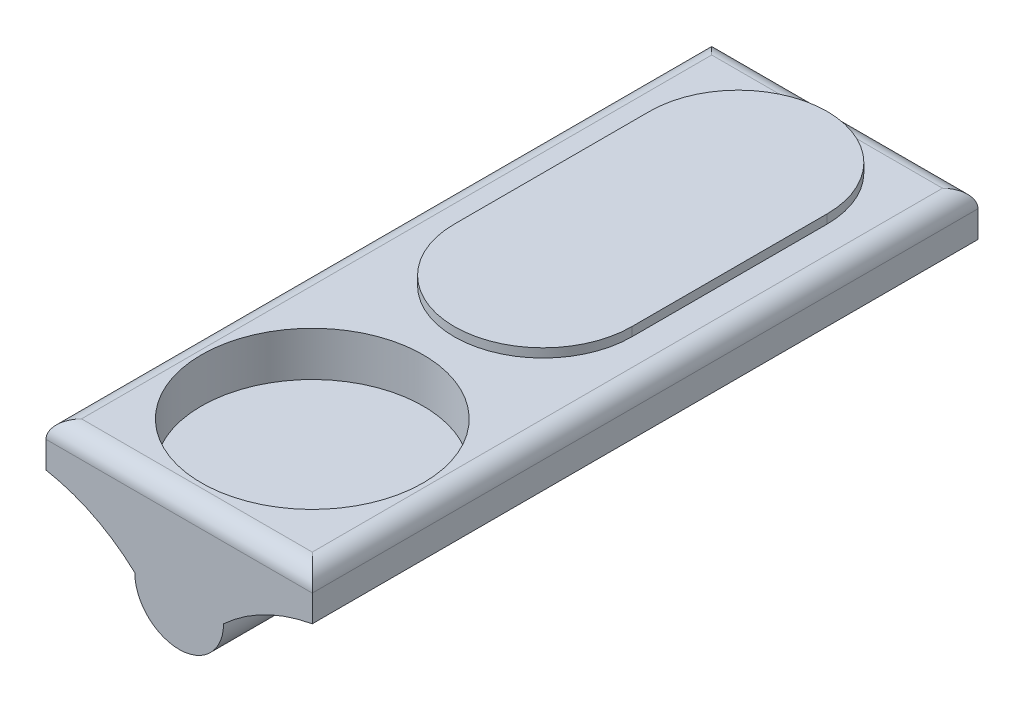
ISO-10303-21;
HEADER;
FILE_DESCRIPTION(('STEP AP214'),'2;1');
FILE_NAME('part.step','',(''),(''),'','','');
FILE_SCHEMA(('AUTOMOTIVE_DESIGN { 1 0 10303 214 1 1 1 1 }'));
ENDSEC;
DATA;
#1=APPLICATION_CONTEXT('core data for automotive mechanical design processes');
#2=APPLICATION_PROTOCOL_DEFINITION('international standard','automotive_design',2000,#1);
#3=PRODUCT_CONTEXT('',#1,'mechanical');
#4=PRODUCT('Part','Part','',(#3));
#5=PRODUCT_RELATED_PRODUCT_CATEGORY('part','',(#4));
#6=PRODUCT_DEFINITION_FORMATION('','',#4);
#7=PRODUCT_DEFINITION_CONTEXT('part definition',#1,'design');
#8=PRODUCT_DEFINITION('design','',#6,#7);
#9=PRODUCT_DEFINITION_SHAPE('','',#8);
#10=(LENGTH_UNIT() NAMED_UNIT(*) SI_UNIT(.MILLI.,.METRE.));
#11=(NAMED_UNIT(*) PLANE_ANGLE_UNIT() SI_UNIT($,.RADIAN.));
#12=(NAMED_UNIT(*) SI_UNIT($,.STERADIAN.) SOLID_ANGLE_UNIT());
#13=UNCERTAINTY_MEASURE_WITH_UNIT(LENGTH_MEASURE(1.E-05),#10,'distance_accuracy_value','');
#14=(GEOMETRIC_REPRESENTATION_CONTEXT(3) GLOBAL_UNCERTAINTY_ASSIGNED_CONTEXT((#13)) GLOBAL_UNIT_ASSIGNED_CONTEXT((#10,
#11,#12)) REPRESENTATION_CONTEXT('',''));
#15=CARTESIAN_POINT('',(0.,0.,0.));
#16=DIRECTION('',(0.,0.,1.));
#17=DIRECTION('',(1.,0.,0.));
#18=AXIS2_PLACEMENT_3D('',#15,#16,#17);
#19=CARTESIAN_POINT('',(18.5877820186588,-14.6755640373177,-75.));
#20=DIRECTION('',(0.,0.,1.));
#21=DIRECTION('',(1.,0.,0.));
#22=AXIS2_PLACEMENT_3D('',#19,#20,#21);
#23=CYLINDRICAL_SURFACE('',#22,20.);
#24=CARTESIAN_POINT('',(18.5877820186588,-14.6755640373177,0.));
#25=DIRECTION('',(0.,0.,-1.));
#26=DIRECTION('',(-1.,0.,0.));
#27=AXIS2_PLACEMENT_3D('',#24,#25,#26);
#28=CIRCLE('',#27,20.);
#29=CARTESIAN_POINT('',(5.,0.,0.));
#30=VERTEX_POINT('',#29);
#31=CARTESIAN_POINT('',(15.,5.00000000000001,0.));
#32=VERTEX_POINT('',#31);
#33=EDGE_CURVE('E179',#30,#32,#28,.T.);
#34=ORIENTED_EDGE('',*,*,#33,.F.);
#35=DIRECTION('',(0.,0.,1.));
#36=VECTOR('',#35,1.);
#37=CARTESIAN_POINT('',(5.,0.,-75.));
#38=LINE('',#37,#36);
#39=CARTESIAN_POINT('',(5.,0.,-75.));
#40=VERTEX_POINT('',#39);
#41=EDGE_CURVE('E218',#40,#30,#38,.T.);
#42=ORIENTED_EDGE('',*,*,#41,.F.);
#43=CARTESIAN_POINT('',(18.5877820186588,-14.6755640373177,-75.));
#44=DIRECTION('',(0.,0.,-1.));
#45=DIRECTION('',(-1.,0.,0.));
#46=AXIS2_PLACEMENT_3D('',#43,#44,#45);
#47=CIRCLE('',#46,20.);
#48=CARTESIAN_POINT('',(15.,5.00000000000001,-75.));
#49=VERTEX_POINT('',#48);
#50=EDGE_CURVE('E181',#40,#49,#47,.T.);
#51=ORIENTED_EDGE('',*,*,#50,.T.);
#52=DIRECTION('',(0.,0.,1.));
#53=VECTOR('',#52,1.);
#54=CARTESIAN_POINT('',(15.,5.00000000000001,-75.));
#55=LINE('',#54,#53);
#56=EDGE_CURVE('E200',#49,#32,#55,.T.);
#57=ORIENTED_EDGE('',*,*,#56,.T.);
#58=EDGE_LOOP('',(#34,#42,#51,#57));
#59=FACE_BOUND('',#58,.T.);
#60=ADVANCED_FACE('F42',(#59),#23,.F.);
#61=CARTESIAN_POINT('',(0.,0.,-75.));
#62=DIRECTION('',(0.,0.,1.));
#63=DIRECTION('',(1.,0.,0.));
#64=AXIS2_PLACEMENT_3D('',#61,#62,#63);
#65=CYLINDRICAL_SURFACE('',#64,5.);
#66=CARTESIAN_POINT('',(0.,0.,0.));
#67=DIRECTION('',(0.,0.,1.));
#68=DIRECTION('',(1.,0.,0.));
#69=AXIS2_PLACEMENT_3D('',#66,#67,#68);
#70=CIRCLE('',#69,5.);
#71=CARTESIAN_POINT('',(-5.,0.,0.));
#72=VERTEX_POINT('',#71);
#73=EDGE_CURVE('E186',#72,#30,#70,.T.);
#74=ORIENTED_EDGE('',*,*,#73,.F.);
#75=DIRECTION('',(0.,0.,1.));
#76=VECTOR('',#75,1.);
#77=CARTESIAN_POINT('',(-5.,0.,-75.));
#78=LINE('',#77,#76);
#79=CARTESIAN_POINT('',(-5.,0.,-75.));
#80=VERTEX_POINT('',#79);
#81=EDGE_CURVE('E222',#80,#72,#78,.T.);
#82=ORIENTED_EDGE('',*,*,#81,.F.);
#83=CARTESIAN_POINT('',(0.,0.,-75.));
#84=DIRECTION('',(0.,0.,1.));
#85=DIRECTION('',(1.,0.,0.));
#86=AXIS2_PLACEMENT_3D('',#83,#84,#85);
#87=CIRCLE('',#86,5.);
#88=EDGE_CURVE('E196',#80,#40,#87,.T.);
#89=ORIENTED_EDGE('',*,*,#88,.T.);
#90=ORIENTED_EDGE('',*,*,#41,.T.);
#91=EDGE_LOOP('',(#74,#82,#89,#90));
#92=FACE_BOUND('',#91,.T.);
#93=ADVANCED_FACE('F333',(#92),#65,.T.);
#94=CARTESIAN_POINT('',(-18.5877820186588,-14.6755640373177,-75.));
#95=DIRECTION('',(0.,0.,1.));
#96=DIRECTION('',(1.,0.,0.));
#97=AXIS2_PLACEMENT_3D('',#94,#95,#96);
#98=CYLINDRICAL_SURFACE('',#97,20.);
#99=CARTESIAN_POINT('',(-18.5877820186588,-14.6755640373177,0.));
#100=DIRECTION('',(0.,0.,-1.));
#101=DIRECTION('',(-1.,0.,0.));
#102=AXIS2_PLACEMENT_3D('',#99,#100,#101);
#103=CIRCLE('',#102,20.);
#104=CARTESIAN_POINT('',(-15.,5.,0.));
#105=VERTEX_POINT('',#104);
#106=EDGE_CURVE('E211',#105,#72,#103,.T.);
#107=ORIENTED_EDGE('',*,*,#106,.F.);
#108=DIRECTION('',(0.,0.,1.));
#109=VECTOR('',#108,1.);
#110=CARTESIAN_POINT('',(-15.,5.,-75.));
#111=LINE('',#110,#109);
#112=CARTESIAN_POINT('',(-15.,5.,-75.));
#113=VERTEX_POINT('',#112);
#114=EDGE_CURVE('E225',#113,#105,#111,.T.);
#115=ORIENTED_EDGE('',*,*,#114,.F.);
#116=CARTESIAN_POINT('',(-18.5877820186588,-14.6755640373177,-75.));
#117=DIRECTION('',(0.,0.,-1.));
#118=DIRECTION('',(-1.,0.,0.));
#119=AXIS2_PLACEMENT_3D('',#116,#117,#118);
#120=CIRCLE('',#119,20.);
#121=EDGE_CURVE('E192',#113,#80,#120,.T.);
#122=ORIENTED_EDGE('',*,*,#121,.T.);
#123=ORIENTED_EDGE('',*,*,#81,.T.);
#124=EDGE_LOOP('',(#107,#115,#122,#123));
#125=FACE_BOUND('',#124,.T.);
#126=ADVANCED_FACE('F330',(#125),#98,.F.);
#127=CARTESIAN_POINT('',(-15.,10.,-75.));
#128=DIRECTION('',(-1.,0.,0.));
#129=DIRECTION('',(0.,-1.,0.));
#130=AXIS2_PLACEMENT_3D('',#127,#128,#129);
#131=PLANE('',#130);
#132=DIRECTION('',(0.,-1.,0.));
#133=VECTOR('',#132,1.);
#134=CARTESIAN_POINT('',(-15.,10.,0.));
#135=LINE('',#134,#133);
#136=CARTESIAN_POINT('',(-15.,8.,0.));
#137=VERTEX_POINT('',#136);
#138=EDGE_CURVE('E208',#137,#105,#135,.T.);
#139=ORIENTED_EDGE('',*,*,#138,.F.);
#140=DIRECTION('',(0.,0.,1.));
#141=VECTOR('',#140,1.);
#142=CARTESIAN_POINT('',(-15.,8.,-75.));
#143=LINE('',#142,#141);
#144=CARTESIAN_POINT('',(-15.,8.,-75.));
#145=VERTEX_POINT('',#144);
#146=EDGE_CURVE('E11',#137,#145,#143,.F.);
#147=ORIENTED_EDGE('',*,*,#146,.T.);
#148=DIRECTION('',(0.,-1.,0.));
#149=VECTOR('',#148,1.);
#150=CARTESIAN_POINT('',(-15.,10.,-75.));
#151=LINE('',#150,#149);
#152=EDGE_CURVE('E189',#145,#113,#151,.T.);
#153=ORIENTED_EDGE('',*,*,#152,.T.);
#154=ORIENTED_EDGE('',*,*,#114,.T.);
#155=EDGE_LOOP('',(#139,#147,#153,#154));
#156=FACE_BOUND('',#155,.T.);
#157=ADVANCED_FACE('F325',(#156),#131,.T.);
#158=CARTESIAN_POINT('',(-15.,10.,-75.));
#159=DIRECTION('',(0.,1.,0.));
#160=DIRECTION('',(-1.,0.,0.));
#161=AXIS2_PLACEMENT_3D('',#158,#159,#160);
#162=PLANE('',#161);
#163=CARTESIAN_POINT('',(0.,10.,-15.));
#164=DIRECTION('',(0.,1.,0.));
#165=DIRECTION('',(-1.,0.,0.));
#166=AXIS2_PLACEMENT_3D('',#163,#164,#165);
#167=CIRCLE('',#166,12.5);
#168=CARTESIAN_POINT('',(-12.5,10.,-15.));
#169=VERTEX_POINT('',#168);
#170=EDGE_CURVE('E268',#169,#169,#167,.T.);
#171=ORIENTED_EDGE('',*,*,#170,.F.);
#172=EDGE_LOOP('',(#171));
#173=FACE_BOUND('',#172,.T.);
#174=DIRECTION('',(0.,0.,1.));
#175=VECTOR('',#174,1.);
#176=CARTESIAN_POINT('',(-13.,10.,-75.));
#177=LINE('',#176,#175);
#178=CARTESIAN_POINT('',(-13.,10.,-73.));
#179=VERTEX_POINT('',#178);
#180=CARTESIAN_POINT('',(-13.,10.,-2.));
#181=VERTEX_POINT('',#180);
#182=EDGE_CURVE('E234',#179,#181,#177,.T.);
#183=ORIENTED_EDGE('',*,*,#182,.T.);
#184=DIRECTION('',(-1.,0.,0.));
#185=VECTOR('',#184,1.);
#186=CARTESIAN_POINT('',(15.,10.,-2.));
#187=LINE('',#186,#185);
#188=CARTESIAN_POINT('',(13.,10.,-2.));
#189=VERTEX_POINT('',#188);
#190=EDGE_CURVE('E246',#181,#189,#187,.F.);
#191=ORIENTED_EDGE('',*,*,#190,.T.);
#192=DIRECTION('',(0.,0.,1.));
#193=VECTOR('',#192,1.);
#194=CARTESIAN_POINT('',(13.,10.,-75.));
#195=LINE('',#194,#193);
#196=CARTESIAN_POINT('',(13.,10.,-73.));
#197=VERTEX_POINT('',#196);
#198=EDGE_CURVE('E243',#189,#197,#195,.F.);
#199=ORIENTED_EDGE('',*,*,#198,.T.);
#200=DIRECTION('',(-1.,0.,0.));
#201=VECTOR('',#200,1.);
#202=CARTESIAN_POINT('',(-15.,10.,-73.));
#203=LINE('',#202,#201);
#204=CARTESIAN_POINT('',(0.,10.,-73.));
#205=VERTEX_POINT('',#204);
#206=EDGE_CURVE('E240',#197,#205,#203,.T.);
#207=ORIENTED_EDGE('',*,*,#206,.T.);
#208=CARTESIAN_POINT('',(0.,10.,-63.));
#209=DIRECTION('',(0.,1.,0.));
#210=DIRECTION('',(-1.,0.,0.));
#211=AXIS2_PLACEMENT_3D('',#208,#209,#210);
#212=CIRCLE('',#211,10.);
#213=CARTESIAN_POINT('',(10.,10.,-63.));
#214=VERTEX_POINT('',#213);
#215=EDGE_CURVE('E288',#214,#205,#212,.T.);
#216=ORIENTED_EDGE('',*,*,#215,.F.);
#217=DIRECTION('',(0.,0.,-1.));
#218=VECTOR('',#217,1.);
#219=CARTESIAN_POINT('',(10.,10.,-63.));
#220=LINE('',#219,#218);
#221=CARTESIAN_POINT('',(10.,10.,-41.));
#222=VERTEX_POINT('',#221);
#223=EDGE_CURVE('E158',#222,#214,#220,.T.);
#224=ORIENTED_EDGE('',*,*,#223,.F.);
#225=CARTESIAN_POINT('',(0.,10.,-41.));
#226=DIRECTION('',(0.,1.,0.));
#227=DIRECTION('',(-1.,0.,0.));
#228=AXIS2_PLACEMENT_3D('',#225,#226,#227);
#229=CIRCLE('',#228,10.);
#230=CARTESIAN_POINT('',(-10.,10.,-41.));
#231=VERTEX_POINT('',#230);
#232=EDGE_CURVE('E294',#231,#222,#229,.T.);
#233=ORIENTED_EDGE('',*,*,#232,.F.);
#234=DIRECTION('',(0.,0.,1.));
#235=VECTOR('',#234,1.);
#236=CARTESIAN_POINT('',(-10.,10.,-63.));
#237=LINE('',#236,#235);
#238=CARTESIAN_POINT('',(-10.,10.,-63.));
#239=VERTEX_POINT('',#238);
#240=EDGE_CURVE('E291',#239,#231,#237,.T.);
#241=ORIENTED_EDGE('',*,*,#240,.F.);
#242=EDGE_CURVE('E163',#205,#239,#212,.T.);
#243=ORIENTED_EDGE('',*,*,#242,.F.);
#244=DIRECTION('',(-1.,0.,0.));
#245=VECTOR('',#244,1.);
#246=CARTESIAN_POINT('',(-15.,10.,-73.));
#247=LINE('',#246,#245);
#248=EDGE_CURVE('E237',#205,#179,#247,.T.);
#249=ORIENTED_EDGE('',*,*,#248,.T.);
#250=EDGE_LOOP('',(#183,#191,#199,#207,#216,#224,#233,#241,#243,#249));
#251=FACE_BOUND('',#250,.T.);
#252=ADVANCED_FACE('F310',(#173,#251),#162,.T.);
#253=CARTESIAN_POINT('',(15.,10.,-75.));
#254=DIRECTION('',(1.,0.,0.));
#255=DIRECTION('',(0.,0.,-1.));
#256=AXIS2_PLACEMENT_3D('',#253,#254,#255);
#257=PLANE('',#256);
#258=DIRECTION('',(0.,1.,0.));
#259=VECTOR('',#258,1.);
#260=CARTESIAN_POINT('',(15.,10.,-75.));
#261=LINE('',#260,#259);
#262=CARTESIAN_POINT('',(15.,8.00000000000001,-75.));
#263=VERTEX_POINT('',#262);
#264=EDGE_CURVE('E185',#49,#263,#261,.T.);
#265=ORIENTED_EDGE('',*,*,#264,.T.);
#266=DIRECTION('',(0.,0.,1.));
#267=VECTOR('',#266,1.);
#268=CARTESIAN_POINT('',(15.,8.00000000000001,-75.));
#269=LINE('',#268,#267);
#270=CARTESIAN_POINT('',(15.,8.00000000000001,0.));
#271=VERTEX_POINT('',#270);
#272=EDGE_CURVE('E250',#263,#271,#269,.T.);
#273=ORIENTED_EDGE('',*,*,#272,.T.);
#274=DIRECTION('',(0.,1.,0.));
#275=VECTOR('',#274,1.);
#276=CARTESIAN_POINT('',(15.,10.,0.));
#277=LINE('',#276,#275);
#278=EDGE_CURVE('E204',#32,#271,#277,.T.);
#279=ORIENTED_EDGE('',*,*,#278,.F.);
#280=ORIENTED_EDGE('',*,*,#56,.F.);
#281=EDGE_LOOP('',(#265,#273,#279,#280));
#282=FACE_BOUND('',#281,.T.);
#283=ADVANCED_FACE('F339',(#282),#257,.T.);
#284=CARTESIAN_POINT('',(18.5877820186588,-14.6755640373177,-75.));
#285=DIRECTION('',(0.,0.,-1.));
#286=DIRECTION('',(-1.,0.,0.));
#287=AXIS2_PLACEMENT_3D('',#284,#285,#286);
#288=PLANE('',#287);
#289=CARTESIAN_POINT('',(0.,0.,-75.));
#290=DIRECTION('',(0.,0.,-1.));
#291=DIRECTION('',(-1.,0.,0.));
#292=AXIS2_PLACEMENT_3D('',#289,#290,#291);
#293=CIRCLE('',#292,4.);
#294=CARTESIAN_POINT('',(-4.,0.,-75.));
#295=VERTEX_POINT('',#294);
#296=EDGE_CURVE('E166',#295,#295,#293,.T.);
#297=ORIENTED_EDGE('',*,*,#296,.F.);
#298=EDGE_LOOP('',(#297));
#299=FACE_BOUND('',#298,.T.);
#300=ORIENTED_EDGE('',*,*,#152,.F.);
#301=DIRECTION('',(-1.,0.,0.));
#302=VECTOR('',#301,1.);
#303=CARTESIAN_POINT('',(18.5877820186588,8.,-75.));
#304=LINE('',#303,#302);
#305=EDGE_CURVE('E52',#145,#263,#304,.F.);
#306=ORIENTED_EDGE('',*,*,#305,.T.);
#307=ORIENTED_EDGE('',*,*,#264,.F.);
#308=ORIENTED_EDGE('',*,*,#50,.F.);
#309=ORIENTED_EDGE('',*,*,#88,.F.);
#310=ORIENTED_EDGE('',*,*,#121,.F.);
#311=EDGE_LOOP('',(#300,#306,#307,#308,#309,#310));
#312=FACE_BOUND('',#311,.T.);
#313=ADVANCED_FACE('F403',(#299,#312),#288,.T.);
#314=CARTESIAN_POINT('',(18.5877820186588,-14.6755640373177,0.));
#315=DIRECTION('',(0.,0.,-1.));
#316=DIRECTION('',(-1.,0.,0.));
#317=AXIS2_PLACEMENT_3D('',#314,#315,#316);
#318=PLANE('',#317);
#319=ORIENTED_EDGE('',*,*,#278,.T.);
#320=DIRECTION('',(-1.,0.,0.));
#321=VECTOR('',#320,1.);
#322=CARTESIAN_POINT('',(-15.,8.,0.));
#323=LINE('',#322,#321);
#324=EDGE_CURVE('E221',#271,#137,#323,.T.);
#325=ORIENTED_EDGE('',*,*,#324,.T.);
#326=ORIENTED_EDGE('',*,*,#138,.T.);
#327=ORIENTED_EDGE('',*,*,#106,.T.);
#328=ORIENTED_EDGE('',*,*,#73,.T.);
#329=ORIENTED_EDGE('',*,*,#33,.T.);
#330=EDGE_LOOP('',(#319,#325,#326,#327,#328,#329));
#331=FACE_BOUND('',#330,.T.);
#332=ADVANCED_FACE('F323',(#331),#318,.F.);
#333=CARTESIAN_POINT('',(0.,0.,-9.99999999999999));
#334=DIRECTION('',(0.,0.,-1.));
#335=DIRECTION('',(-1.,0.,0.));
#336=AXIS2_PLACEMENT_3D('',#333,#334,#335);
#337=CYLINDRICAL_SURFACE('',#336,4.);
#338=CARTESIAN_POINT('',(0.,0.,-9.99999999999999));
#339=DIRECTION('',(0.,0.,-1.));
#340=DIRECTION('',(-1.,0.,0.));
#341=AXIS2_PLACEMENT_3D('',#338,#339,#340);
#342=CIRCLE('',#341,4.);
#343=CARTESIAN_POINT('',(-4.,0.,-9.99999999999999));
#344=VERTEX_POINT('',#343);
#345=EDGE_CURVE('E171',#344,#344,#342,.T.);
#346=ORIENTED_EDGE('',*,*,#345,.F.);
#347=EDGE_LOOP('',(#346));
#348=FACE_BOUND('',#347,.T.);
#349=ORIENTED_EDGE('',*,*,#296,.T.);
#350=EDGE_LOOP('',(#349));
#351=FACE_BOUND('',#350,.T.);
#352=ADVANCED_FACE('F402',(#348,#351),#337,.F.);
#353=CARTESIAN_POINT('',(0.,0.,-9.99999999999999));
#354=DIRECTION('',(0.,0.,-1.));
#355=DIRECTION('',(-1.,0.,0.));
#356=AXIS2_PLACEMENT_3D('',#353,#354,#355);
#357=PLANE('',#356);
#358=ORIENTED_EDGE('',*,*,#345,.T.);
#359=EDGE_LOOP('',(#358));
#360=FACE_BOUND('',#359,.T.);
#361=ADVANCED_FACE('F388',(#360),#357,.T.);
#362=CARTESIAN_POINT('',(0.,11.,-63.));
#363=DIRECTION('',(0.,-1.,0.));
#364=DIRECTION('',(1.,0.,0.));
#365=AXIS2_PLACEMENT_3D('',#362,#363,#364);
#366=CYLINDRICAL_SURFACE('',#365,10.);
#367=ORIENTED_EDGE('',*,*,#215,.T.);
#368=ORIENTED_EDGE('',*,*,#242,.T.);
#369=DIRECTION('',(0.,-1.,0.));
#370=VECTOR('',#369,1.);
#371=CARTESIAN_POINT('',(-10.,11.,-63.));
#372=LINE('',#371,#370);
#373=CARTESIAN_POINT('',(-10.,11.,-63.));
#374=VERTEX_POINT('',#373);
#375=EDGE_CURVE('E141',#374,#239,#372,.T.);
#376=ORIENTED_EDGE('',*,*,#375,.F.);
#377=CARTESIAN_POINT('',(0.,11.,-63.));
#378=DIRECTION('',(0.,1.,0.));
#379=DIRECTION('',(-1.,0.,0.));
#380=AXIS2_PLACEMENT_3D('',#377,#378,#379);
#381=CIRCLE('',#380,10.);
#382=CARTESIAN_POINT('',(10.,11.,-63.));
#383=VERTEX_POINT('',#382);
#384=EDGE_CURVE('E148',#383,#374,#381,.T.);
#385=ORIENTED_EDGE('',*,*,#384,.F.);
#386=DIRECTION('',(0.,-1.,0.));
#387=VECTOR('',#386,1.);
#388=CARTESIAN_POINT('',(10.,11.,-63.));
#389=LINE('',#388,#387);
#390=EDGE_CURVE('E287',#383,#214,#389,.T.);
#391=ORIENTED_EDGE('',*,*,#390,.T.);
#392=EDGE_LOOP('',(#367,#368,#376,#385,#391));
#393=FACE_BOUND('',#392,.T.);
#394=ADVANCED_FACE('F161',(#393),#366,.T.);
#395=CARTESIAN_POINT('',(-10.,11.,-63.));
#396=DIRECTION('',(1.,0.,0.));
#397=DIRECTION('',(0.,1.,0.));
#398=AXIS2_PLACEMENT_3D('',#395,#396,#397);
#399=PLANE('',#398);
#400=ORIENTED_EDGE('',*,*,#240,.T.);
#401=DIRECTION('',(0.,-1.,0.));
#402=VECTOR('',#401,1.);
#403=CARTESIAN_POINT('',(-10.,11.,-41.));
#404=LINE('',#403,#402);
#405=CARTESIAN_POINT('',(-10.,11.,-41.));
#406=VERTEX_POINT('',#405);
#407=EDGE_CURVE('E143',#406,#231,#404,.T.);
#408=ORIENTED_EDGE('',*,*,#407,.F.);
#409=DIRECTION('',(0.,0.,1.));
#410=VECTOR('',#409,1.);
#411=CARTESIAN_POINT('',(-10.,11.,-63.));
#412=LINE('',#411,#410);
#413=EDGE_CURVE('E136',#374,#406,#412,.T.);
#414=ORIENTED_EDGE('',*,*,#413,.F.);
#415=ORIENTED_EDGE('',*,*,#375,.T.);
#416=EDGE_LOOP('',(#400,#408,#414,#415));
#417=FACE_BOUND('',#416,.T.);
#418=ADVANCED_FACE('F139',(#417),#399,.F.);
#419=CARTESIAN_POINT('',(0.,11.,-41.));
#420=DIRECTION('',(0.,-1.,0.));
#421=DIRECTION('',(1.,0.,0.));
#422=AXIS2_PLACEMENT_3D('',#419,#420,#421);
#423=CYLINDRICAL_SURFACE('',#422,10.);
#424=ORIENTED_EDGE('',*,*,#232,.T.);
#425=DIRECTION('',(0.,-1.,0.));
#426=VECTOR('',#425,1.);
#427=CARTESIAN_POINT('',(10.,11.,-41.));
#428=LINE('',#427,#426);
#429=CARTESIAN_POINT('',(10.,11.,-41.));
#430=VERTEX_POINT('',#429);
#431=EDGE_CURVE('E173',#430,#222,#428,.T.);
#432=ORIENTED_EDGE('',*,*,#431,.F.);
#433=CARTESIAN_POINT('',(0.,11.,-41.));
#434=DIRECTION('',(0.,1.,0.));
#435=DIRECTION('',(-1.,0.,0.));
#436=AXIS2_PLACEMENT_3D('',#433,#434,#435);
#437=CIRCLE('',#436,10.);
#438=EDGE_CURVE('E147',#406,#430,#437,.T.);
#439=ORIENTED_EDGE('',*,*,#438,.F.);
#440=ORIENTED_EDGE('',*,*,#407,.T.);
#441=EDGE_LOOP('',(#424,#432,#439,#440));
#442=FACE_BOUND('',#441,.T.);
#443=ADVANCED_FACE('F308',(#442),#423,.T.);
#444=CARTESIAN_POINT('',(10.,11.,-63.));
#445=DIRECTION('',(-1.,0.,0.));
#446=DIRECTION('',(0.,0.,1.));
#447=AXIS2_PLACEMENT_3D('',#444,#445,#446);
#448=PLANE('',#447);
#449=ORIENTED_EDGE('',*,*,#223,.T.);
#450=ORIENTED_EDGE('',*,*,#390,.F.);
#451=DIRECTION('',(0.,0.,-1.));
#452=VECTOR('',#451,1.);
#453=CARTESIAN_POINT('',(10.,11.,-63.));
#454=LINE('',#453,#452);
#455=EDGE_CURVE('E153',#430,#383,#454,.T.);
#456=ORIENTED_EDGE('',*,*,#455,.F.);
#457=ORIENTED_EDGE('',*,*,#431,.T.);
#458=EDGE_LOOP('',(#449,#450,#456,#457));
#459=FACE_BOUND('',#458,.T.);
#460=ADVANCED_FACE('F306',(#459),#448,.F.);
#461=CARTESIAN_POINT('',(0.,11.,-63.));
#462=DIRECTION('',(0.,1.,0.));
#463=DIRECTION('',(-1.,0.,0.));
#464=AXIS2_PLACEMENT_3D('',#461,#462,#463);
#465=PLANE('',#464);
#466=ORIENTED_EDGE('',*,*,#384,.T.);
#467=ORIENTED_EDGE('',*,*,#413,.T.);
#468=ORIENTED_EDGE('',*,*,#438,.T.);
#469=ORIENTED_EDGE('',*,*,#455,.T.);
#470=EDGE_LOOP('',(#466,#467,#468,#469));
#471=FACE_BOUND('',#470,.T.);
#472=ADVANCED_FACE('F151',(#471),#465,.T.);
#473=CARTESIAN_POINT('',(0.,5.,-15.));
#474=DIRECTION('',(0.,1.,0.));
#475=DIRECTION('',(-1.,0.,0.));
#476=AXIS2_PLACEMENT_3D('',#473,#474,#475);
#477=CYLINDRICAL_SURFACE('',#476,12.5);
#478=CARTESIAN_POINT('',(0.,5.,-15.));
#479=DIRECTION('',(0.,1.,0.));
#480=DIRECTION('',(-1.,0.,0.));
#481=AXIS2_PLACEMENT_3D('',#478,#479,#480);
#482=CIRCLE('',#481,12.5);
#483=CARTESIAN_POINT('',(-12.5,5.,-15.));
#484=VERTEX_POINT('',#483);
#485=EDGE_CURVE('E275',#484,#484,#482,.T.);
#486=ORIENTED_EDGE('',*,*,#485,.F.);
#487=EDGE_LOOP('',(#486));
#488=FACE_BOUND('',#487,.T.);
#489=ORIENTED_EDGE('',*,*,#170,.T.);
#490=EDGE_LOOP('',(#489));
#491=FACE_BOUND('',#490,.T.);
#492=ADVANCED_FACE('F451',(#488,#491),#477,.F.);
#493=CARTESIAN_POINT('',(0.,5.,-15.));
#494=DIRECTION('',(0.,1.,0.));
#495=DIRECTION('',(-1.,0.,0.));
#496=AXIS2_PLACEMENT_3D('',#493,#494,#495);
#497=PLANE('',#496);
#498=ORIENTED_EDGE('',*,*,#485,.T.);
#499=EDGE_LOOP('',(#498));
#500=FACE_BOUND('',#499,.T.);
#501=ADVANCED_FACE('F347',(#500),#497,.T.);
#502=CARTESIAN_POINT('',(-15.,8.,-73.));
#503=DIRECTION('',(-1.,0.,0.));
#504=DIRECTION('',(0.,-1.,0.));
#505=AXIS2_PLACEMENT_3D('',#502,#503,#504);
#506=CYLINDRICAL_SURFACE('',#505,2.);
#507=ORIENTED_EDGE('',*,*,#248,.F.);
#508=ORIENTED_EDGE('',*,*,#206,.F.);
#509=CARTESIAN_POINT('',(13.,8.00000000000001,-73.));
#510=DIRECTION('',(-0.707106781186547,0.,-0.707106781186547));
#511=DIRECTION('',(-0.707106781186547,0.,0.707106781186547));
#512=AXIS2_PLACEMENT_3D('',#509,#510,#511);
#513=ELLIPSE('',#512,2.82842712474619,2.);
#514=EDGE_CURVE('E46',#263,#197,#513,.F.);
#515=ORIENTED_EDGE('',*,*,#514,.F.);
#516=ORIENTED_EDGE('',*,*,#305,.F.);
#517=CARTESIAN_POINT('',(-13.,8.,-73.));
#518=DIRECTION('',(-0.707106781186547,0.,0.707106781186547));
#519=DIRECTION('',(0.707106781186547,0.,0.707106781186547));
#520=AXIS2_PLACEMENT_3D('',#517,#518,#519);
#521=ELLIPSE('',#520,2.82842712474619,2.);
#522=EDGE_CURVE('E260',#179,#145,#521,.T.);
#523=ORIENTED_EDGE('',*,*,#522,.F.);
#524=EDGE_LOOP('',(#507,#508,#515,#516,#523));
#525=FACE_BOUND('',#524,.T.);
#526=ADVANCED_FACE('F44',(#525),#506,.T.);
#527=CARTESIAN_POINT('',(13.,8.00000000000001,-75.));
#528=DIRECTION('',(0.,0.,1.));
#529=DIRECTION('',(1.,0.,0.));
#530=AXIS2_PLACEMENT_3D('',#527,#528,#529);
#531=CYLINDRICAL_SURFACE('',#530,2.);
#532=ORIENTED_EDGE('',*,*,#514,.T.);
#533=ORIENTED_EDGE('',*,*,#198,.F.);
#534=CARTESIAN_POINT('',(13.,8.00000000000001,-2.));
#535=DIRECTION('',(-0.707106781186547,0.,0.707106781186547));
#536=DIRECTION('',(0.707106781186547,0.,0.707106781186547));
#537=AXIS2_PLACEMENT_3D('',#534,#535,#536);
#538=ELLIPSE('',#537,2.82842712474619,2.);
#539=EDGE_CURVE('E258',#271,#189,#538,.T.);
#540=ORIENTED_EDGE('',*,*,#539,.F.);
#541=ORIENTED_EDGE('',*,*,#272,.F.);
#542=EDGE_LOOP('',(#532,#533,#540,#541));
#543=FACE_BOUND('',#542,.T.);
#544=ADVANCED_FACE('F340',(#543),#531,.T.);
#545=CARTESIAN_POINT('',(-13.,8.,-75.));
#546=DIRECTION('',(0.,0.,1.));
#547=DIRECTION('',(1.,0.,0.));
#548=AXIS2_PLACEMENT_3D('',#545,#546,#547);
#549=CYLINDRICAL_SURFACE('',#548,2.);
#550=ORIENTED_EDGE('',*,*,#522,.T.);
#551=ORIENTED_EDGE('',*,*,#146,.F.);
#552=CARTESIAN_POINT('',(-13.,8.,-2.));
#553=DIRECTION('',(0.707106781186547,0.,0.707106781186547));
#554=DIRECTION('',(-0.707106781186547,0.,0.707106781186547));
#555=AXIS2_PLACEMENT_3D('',#552,#553,#554);
#556=ELLIPSE('',#555,2.82842712474619,2.);
#557=EDGE_CURVE('E255',#181,#137,#556,.T.);
#558=ORIENTED_EDGE('',*,*,#557,.F.);
#559=ORIENTED_EDGE('',*,*,#182,.F.);
#560=EDGE_LOOP('',(#550,#551,#558,#559));
#561=FACE_BOUND('',#560,.T.);
#562=ADVANCED_FACE('F321',(#561),#549,.T.);
#563=CARTESIAN_POINT('',(18.5877820186588,8.00000000000001,-2.));
#564=DIRECTION('',(1.,0.,0.));
#565=DIRECTION('',(0.,1.,0.));
#566=AXIS2_PLACEMENT_3D('',#563,#564,#565);
#567=CYLINDRICAL_SURFACE('',#566,2.);
#568=ORIENTED_EDGE('',*,*,#539,.T.);
#569=ORIENTED_EDGE('',*,*,#190,.F.);
#570=ORIENTED_EDGE('',*,*,#557,.T.);
#571=ORIENTED_EDGE('',*,*,#324,.F.);
#572=EDGE_LOOP('',(#568,#569,#570,#571));
#573=FACE_BOUND('',#572,.T.);
#574=ADVANCED_FACE('F318',(#573),#567,.T.);
#575=CLOSED_SHELL('',(#60,#93,#126,#157,#252,#283,#313,#332,#352,#361,#394,#418,#443,#460,#472,
#492,#501,#526,#544,#562,#574));
#576=MANIFOLD_SOLID_BREP('B2',#575);
#577=ADVANCED_BREP_SHAPE_REPRESENTATION('',(#18,#576),#14);
#578=SHAPE_DEFINITION_REPRESENTATION(#9,#577);
ENDSEC;
END-ISO-10303-21;
